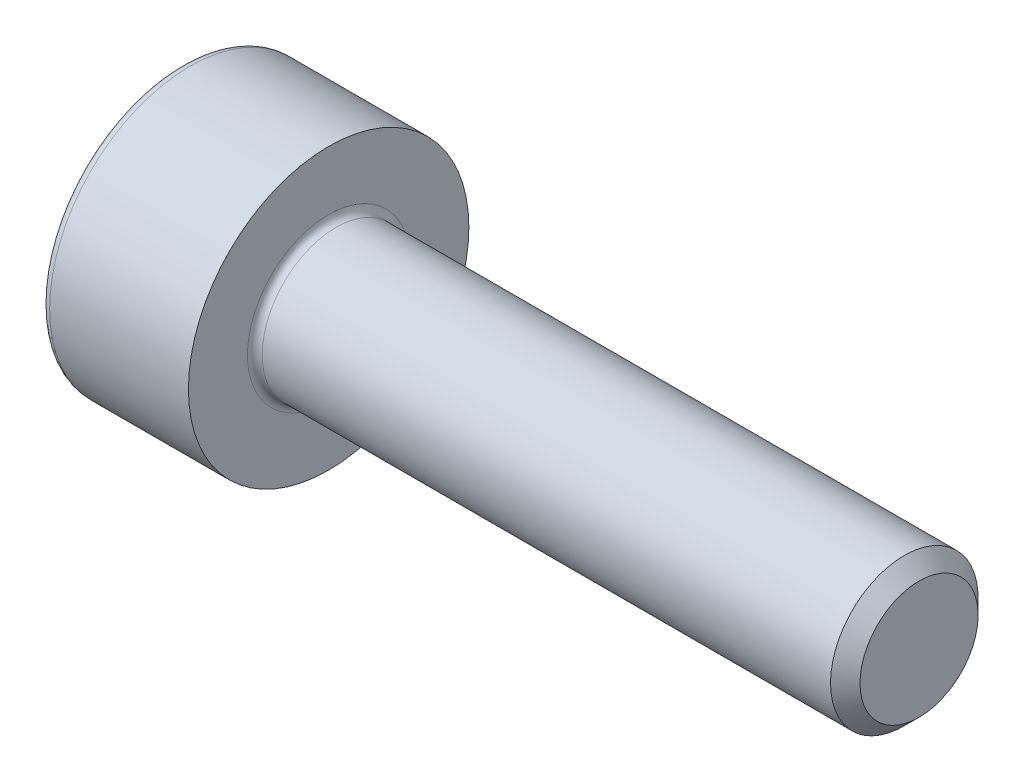
ISO-10303-21;
HEADER;
FILE_DESCRIPTION(('STEP AP214'),'2;1');
FILE_NAME('part.step','',(''),(''),'','','');
FILE_SCHEMA(('AUTOMOTIVE_DESIGN { 1 0 10303 214 1 1 1 1 }'));
ENDSEC;
DATA;
#1=APPLICATION_CONTEXT('core data for automotive mechanical design processes');
#2=APPLICATION_PROTOCOL_DEFINITION('international standard','automotive_design',2000,#1);
#3=PRODUCT_CONTEXT('',#1,'mechanical');
#4=PRODUCT('Part','Part','',(#3));
#5=PRODUCT_RELATED_PRODUCT_CATEGORY('part','',(#4));
#6=PRODUCT_DEFINITION_FORMATION('','',#4);
#7=PRODUCT_DEFINITION_CONTEXT('part definition',#1,'design');
#8=PRODUCT_DEFINITION('design','',#6,#7);
#9=PRODUCT_DEFINITION_SHAPE('','',#8);
#10=(LENGTH_UNIT() NAMED_UNIT(*) SI_UNIT(.MILLI.,.METRE.));
#11=(NAMED_UNIT(*) PLANE_ANGLE_UNIT() SI_UNIT($,.RADIAN.));
#12=(NAMED_UNIT(*) SI_UNIT($,.STERADIAN.) SOLID_ANGLE_UNIT());
#13=UNCERTAINTY_MEASURE_WITH_UNIT(LENGTH_MEASURE(1.E-05),#10,'distance_accuracy_value','');
#14=(GEOMETRIC_REPRESENTATION_CONTEXT(3) GLOBAL_UNCERTAINTY_ASSIGNED_CONTEXT((#13)) GLOBAL_UNIT_ASSIGNED_CONTEXT((#10,
#11,#12)) REPRESENTATION_CONTEXT('',''));
#15=CARTESIAN_POINT('',(0.,0.,0.));
#16=DIRECTION('',(0.,0.,1.));
#17=DIRECTION('',(1.,0.,0.));
#18=AXIS2_PLACEMENT_3D('',#15,#16,#17);
#19=CARTESIAN_POINT('',(10.0000000000048,0.,0.));
#20=DIRECTION('',(-1.,0.,0.));
#21=DIRECTION('',(0.,0.,1.));
#22=AXIS2_PLACEMENT_3D('',#19,#20,#21);
#23=PLANE('',#22);
#24=CARTESIAN_POINT('',(10.0000000000048,0.,0.));
#25=DIRECTION('',(-1.,0.,0.));
#26=DIRECTION('',(0.,0.,1.));
#27=AXIS2_PLACEMENT_3D('',#24,#25,#26);
#28=CIRCLE('',#27,0.799999999999999);
#29=CARTESIAN_POINT('',(10.0000000000048,0.,0.799999999999999));
#30=VERTEX_POINT('',#29);
#31=EDGE_CURVE('E11',#30,#30,#28,.F.);
#32=ORIENTED_EDGE('',*,*,#31,.T.);
#33=EDGE_LOOP('',(#32));
#34=FACE_BOUND('',#33,.T.);
#35=ADVANCED_FACE('F37',(#34),#23,.F.);
#36=CARTESIAN_POINT('',(0.,0.,0.));
#37=DIRECTION('',(-1.,0.,0.));
#38=DIRECTION('',(0.,0.,1.));
#39=AXIS2_PLACEMENT_3D('',#36,#37,#38);
#40=CYLINDRICAL_SURFACE('',#39,1.);
#41=CARTESIAN_POINT('',(9.80000000000477,0.,0.));
#42=DIRECTION('',(-1.,0.,0.));
#43=DIRECTION('',(0.,0.,1.));
#44=AXIS2_PLACEMENT_3D('',#41,#42,#43);
#45=CIRCLE('',#44,1.);
#46=CARTESIAN_POINT('',(9.80000000000477,0.,1.));
#47=VERTEX_POINT('',#46);
#48=EDGE_CURVE('E45',#47,#47,#45,.T.);
#49=ORIENTED_EDGE('',*,*,#48,.T.);
#50=EDGE_LOOP('',(#49));
#51=FACE_BOUND('',#50,.T.);
#52=CARTESIAN_POINT('',(2.10000000000477,0.,0.));
#53=DIRECTION('',(1.,0.,0.));
#54=DIRECTION('',(0.,0.,-1.));
#55=AXIS2_PLACEMENT_3D('',#52,#53,#54);
#56=CIRCLE('',#55,1.);
#57=CARTESIAN_POINT('',(2.10000000000477,0.,-1.));
#58=VERTEX_POINT('',#57);
#59=EDGE_CURVE('E150',#58,#58,#56,.T.);
#60=ORIENTED_EDGE('',*,*,#59,.T.);
#61=EDGE_LOOP('',(#60));
#62=FACE_BOUND('',#61,.T.);
#63=ADVANCED_FACE('F161',(#51,#62),#40,.T.);
#64=CARTESIAN_POINT('',(2.00000000000477,0.,0.));
#65=DIRECTION('',(1.,0.,0.));
#66=DIRECTION('',(0.,0.,-1.));
#67=AXIS2_PLACEMENT_3D('',#64,#65,#66);
#68=PLANE('',#67);
#69=CARTESIAN_POINT('',(2.00000000000477,0.,0.));
#70=DIRECTION('',(1.,0.,0.));
#71=DIRECTION('',(0.,0.,-1.));
#72=AXIS2_PLACEMENT_3D('',#69,#70,#71);
#73=CIRCLE('',#72,1.1);
#74=CARTESIAN_POINT('',(2.00000000000477,0.,-1.1));
#75=VERTEX_POINT('',#74);
#76=EDGE_CURVE('E147',#75,#75,#73,.F.);
#77=ORIENTED_EDGE('',*,*,#76,.T.);
#78=EDGE_LOOP('',(#77));
#79=FACE_BOUND('',#78,.T.);
#80=CARTESIAN_POINT('',(2.00000000000477,0.,0.));
#81=DIRECTION('',(-1.,0.,0.));
#82=DIRECTION('',(0.,0.,1.));
#83=AXIS2_PLACEMENT_3D('',#80,#81,#82);
#84=CIRCLE('',#83,1.9);
#85=CARTESIAN_POINT('',(2.00000000000477,0.,1.9));
#86=VERTEX_POINT('',#85);
#87=EDGE_CURVE('E139',#86,#86,#84,.T.);
#88=ORIENTED_EDGE('',*,*,#87,.F.);
#89=EDGE_LOOP('',(#88));
#90=FACE_BOUND('',#89,.T.);
#91=ADVANCED_FACE('F183',(#79,#90),#68,.T.);
#92=CARTESIAN_POINT('',(0.,0.,0.));
#93=DIRECTION('',(-1.,0.,0.));
#94=DIRECTION('',(0.,0.,1.));
#95=AXIS2_PLACEMENT_3D('',#92,#93,#94);
#96=CYLINDRICAL_SURFACE('',#95,1.9);
#97=CARTESIAN_POINT('',(0.12,0.,0.));
#98=DIRECTION('',(-1.,0.,0.));
#99=DIRECTION('',(0.,0.,1.));
#100=AXIS2_PLACEMENT_3D('',#97,#98,#99);
#101=CIRCLE('',#100,1.9);
#102=CARTESIAN_POINT('',(0.12,0.,1.9));
#103=VERTEX_POINT('',#102);
#104=EDGE_CURVE('E156',#103,#103,#101,.F.);
#105=ORIENTED_EDGE('',*,*,#104,.T.);
#106=EDGE_LOOP('',(#105));
#107=FACE_BOUND('',#106,.T.);
#108=ORIENTED_EDGE('',*,*,#87,.T.);
#109=EDGE_LOOP('',(#108));
#110=FACE_BOUND('',#109,.T.);
#111=ADVANCED_FACE('F193',(#107,#110),#96,.T.);
#112=CARTESIAN_POINT('',(0.,0.,0.));
#113=DIRECTION('',(-1.,0.,0.));
#114=DIRECTION('',(0.,0.,1.));
#115=AXIS2_PLACEMENT_3D('',#112,#113,#114);
#116=PLANE('',#115);
#117=DIRECTION('',(0.,0.5,-0.866025403784439));
#118=VECTOR('',#117,1.);
#119=CARTESIAN_POINT('',(0.,0.43301270189222,0.749999999999999));
#120=LINE('',#119,#118);
#121=CARTESIAN_POINT('',(0.,0.43301270189222,0.749999999999999));
#122=VERTEX_POINT('',#121);
#123=CARTESIAN_POINT('',(0.,0.866025403784438,0.));
#124=VERTEX_POINT('',#123);
#125=EDGE_CURVE('E52',#122,#124,#120,.T.);
#126=ORIENTED_EDGE('',*,*,#125,.F.);
#127=DIRECTION('',(0.,1.,0.));
#128=VECTOR('',#127,1.);
#129=CARTESIAN_POINT('',(0.,-0.43301270189222,0.749999999999999));
#130=LINE('',#129,#128);
#131=CARTESIAN_POINT('',(0.,-0.43301270189222,0.749999999999999));
#132=VERTEX_POINT('',#131);
#133=EDGE_CURVE('E135',#132,#122,#130,.T.);
#134=ORIENTED_EDGE('',*,*,#133,.F.);
#135=DIRECTION('',(0.,0.5,0.866025403784439));
#136=VECTOR('',#135,1.);
#137=CARTESIAN_POINT('',(0.,-0.866025403784438,0.));
#138=LINE('',#137,#136);
#139=CARTESIAN_POINT('',(0.,-0.866025403784438,0.));
#140=VERTEX_POINT('',#139);
#141=EDGE_CURVE('E133',#140,#132,#138,.T.);
#142=ORIENTED_EDGE('',*,*,#141,.F.);
#143=DIRECTION('',(0.,-0.5,0.866025403784439));
#144=VECTOR('',#143,1.);
#145=CARTESIAN_POINT('',(0.,-0.433012701892219,-0.75));
#146=LINE('',#145,#144);
#147=CARTESIAN_POINT('',(0.,-0.433012701892219,-0.75));
#148=VERTEX_POINT('',#147);
#149=EDGE_CURVE('E100',#148,#140,#146,.T.);
#150=ORIENTED_EDGE('',*,*,#149,.F.);
#151=DIRECTION('',(0.,-1.,0.));
#152=VECTOR('',#151,1.);
#153=CARTESIAN_POINT('',(0.,0.433012701892219,-0.75));
#154=LINE('',#153,#152);
#155=CARTESIAN_POINT('',(0.,0.433012701892219,-0.75));
#156=VERTEX_POINT('',#155);
#157=EDGE_CURVE('E129',#156,#148,#154,.T.);
#158=ORIENTED_EDGE('',*,*,#157,.F.);
#159=DIRECTION('',(0.,-0.5,-0.866025403784439));
#160=VECTOR('',#159,1.);
#161=CARTESIAN_POINT('',(0.,0.866025403784438,0.));
#162=LINE('',#161,#160);
#163=EDGE_CURVE('E126',#124,#156,#162,.T.);
#164=ORIENTED_EDGE('',*,*,#163,.F.);
#165=EDGE_LOOP('',(#126,#134,#142,#150,#158,#164));
#166=FACE_BOUND('',#165,.T.);
#167=CARTESIAN_POINT('',(0.,0.,0.));
#168=DIRECTION('',(-1.,0.,0.));
#169=DIRECTION('',(0.,0.,1.));
#170=AXIS2_PLACEMENT_3D('',#167,#168,#169);
#171=CIRCLE('',#170,1.78);
#172=CARTESIAN_POINT('',(0.,0.,1.78));
#173=VERTEX_POINT('',#172);
#174=EDGE_CURVE('E153',#173,#173,#171,.T.);
#175=ORIENTED_EDGE('',*,*,#174,.T.);
#176=EDGE_LOOP('',(#175));
#177=FACE_BOUND('',#176,.T.);
#178=ADVANCED_FACE('F188',(#166,#177),#116,.T.);
#179=CARTESIAN_POINT('',(2.10000000000477,0.,0.));
#180=DIRECTION('',(1.,0.,0.));
#181=DIRECTION('',(0.,0.,-1.));
#182=AXIS2_PLACEMENT_3D('',#179,#180,#181);
#183=TOROIDAL_SURFACE('',#182,1.1,0.1);
#184=ORIENTED_EDGE('',*,*,#59,.F.);
#185=EDGE_LOOP('',(#184));
#186=FACE_BOUND('',#185,.T.);
#187=ORIENTED_EDGE('',*,*,#76,.F.);
#188=EDGE_LOOP('',(#187));
#189=FACE_BOUND('',#188,.T.);
#190=ADVANCED_FACE('F174',(#186,#189),#183,.F.);
#191=CARTESIAN_POINT('',(0.12,0.,0.));
#192=DIRECTION('',(-1.,0.,0.));
#193=DIRECTION('',(0.,0.,1.));
#194=AXIS2_PLACEMENT_3D('',#191,#192,#193);
#195=TOROIDAL_SURFACE('',#194,1.78,0.12);
#196=ORIENTED_EDGE('',*,*,#104,.F.);
#197=EDGE_LOOP('',(#196));
#198=FACE_BOUND('',#197,.T.);
#199=ORIENTED_EDGE('',*,*,#174,.F.);
#200=EDGE_LOOP('',(#199));
#201=FACE_BOUND('',#200,.T.);
#202=ADVANCED_FACE('F166',(#198,#201),#195,.T.);
#203=CARTESIAN_POINT('',(9.80000000000477,0.,0.));
#204=DIRECTION('',(-1.,0.,0.));
#205=DIRECTION('',(0.,0.,1.));
#206=AXIS2_PLACEMENT_3D('',#203,#204,#205);
#207=CONICAL_SURFACE('',#206,1.,0.785398163397448);
#208=ORIENTED_EDGE('',*,*,#31,.F.);
#209=EDGE_LOOP('',(#208));
#210=FACE_BOUND('',#209,.T.);
#211=ORIENTED_EDGE('',*,*,#48,.F.);
#212=EDGE_LOOP('',(#211));
#213=FACE_BOUND('',#212,.T.);
#214=ADVANCED_FACE('F39',(#210,#213),#207,.T.);
#215=CARTESIAN_POINT('',(1.,0.43301270189222,0.749999999999999));
#216=DIRECTION('',(0.,0.866025403784439,0.5));
#217=DIRECTION('',(0.,-0.5,0.866025403784439));
#218=AXIS2_PLACEMENT_3D('',#215,#216,#217);
#219=PLANE('',#218);
#220=ORIENTED_EDGE('',*,*,#125,.T.);
#221=DIRECTION('',(-1.,0.,0.));
#222=VECTOR('',#221,1.);
#223=CARTESIAN_POINT('',(1.,0.866025403784438,0.));
#224=LINE('',#223,#222);
#225=CARTESIAN_POINT('',(1.,0.866025403784438,0.));
#226=VERTEX_POINT('',#225);
#227=EDGE_CURVE('E82',#226,#124,#224,.T.);
#228=ORIENTED_EDGE('',*,*,#227,.F.);
#229=DIRECTION('',(0.,0.5,-0.866025403784439));
#230=VECTOR('',#229,1.);
#231=CARTESIAN_POINT('',(1.,0.43301270189222,0.749999999999999));
#232=LINE('',#231,#230);
#233=CARTESIAN_POINT('',(1.,0.43301270189222,0.749999999999999));
#234=VERTEX_POINT('',#233);
#235=EDGE_CURVE('E137',#234,#226,#232,.T.);
#236=ORIENTED_EDGE('',*,*,#235,.F.);
#237=DIRECTION('',(-1.,0.,0.));
#238=VECTOR('',#237,1.);
#239=CARTESIAN_POINT('',(1.,0.43301270189222,0.749999999999999));
#240=LINE('',#239,#238);
#241=EDGE_CURVE('E60',#234,#122,#240,.T.);
#242=ORIENTED_EDGE('',*,*,#241,.T.);
#243=EDGE_LOOP('',(#220,#228,#236,#242));
#244=FACE_BOUND('',#243,.T.);
#245=ADVANCED_FACE('F165',(#244),#219,.F.);
#246=CARTESIAN_POINT('',(1.,-0.43301270189222,0.749999999999999));
#247=DIRECTION('',(0.,0.,1.));
#248=DIRECTION('',(0.,-1.,0.));
#249=AXIS2_PLACEMENT_3D('',#246,#247,#248);
#250=PLANE('',#249);
#251=ORIENTED_EDGE('',*,*,#133,.T.);
#252=ORIENTED_EDGE('',*,*,#241,.F.);
#253=DIRECTION('',(0.,1.,0.));
#254=VECTOR('',#253,1.);
#255=CARTESIAN_POINT('',(1.,-0.43301270189222,0.749999999999999));
#256=LINE('',#255,#254);
#257=CARTESIAN_POINT('',(1.,-0.43301270189222,0.749999999999999));
#258=VERTEX_POINT('',#257);
#259=EDGE_CURVE('E112',#258,#234,#256,.T.);
#260=ORIENTED_EDGE('',*,*,#259,.F.);
#261=DIRECTION('',(-1.,0.,0.));
#262=VECTOR('',#261,1.);
#263=CARTESIAN_POINT('',(1.,-0.43301270189222,0.749999999999999));
#264=LINE('',#263,#262);
#265=EDGE_CURVE('E104',#258,#132,#264,.T.);
#266=ORIENTED_EDGE('',*,*,#265,.T.);
#267=EDGE_LOOP('',(#251,#252,#260,#266));
#268=FACE_BOUND('',#267,.T.);
#269=ADVANCED_FACE('F172',(#268),#250,.F.);
#270=CARTESIAN_POINT('',(1.,-0.866025403784438,0.));
#271=DIRECTION('',(0.,-0.866025403784439,0.5));
#272=DIRECTION('',(0.,-0.5,-0.866025403784439));
#273=AXIS2_PLACEMENT_3D('',#270,#271,#272);
#274=PLANE('',#273);
#275=ORIENTED_EDGE('',*,*,#141,.T.);
#276=ORIENTED_EDGE('',*,*,#265,.F.);
#277=DIRECTION('',(0.,0.5,0.866025403784439));
#278=VECTOR('',#277,1.);
#279=CARTESIAN_POINT('',(1.,-0.866025403784438,0.));
#280=LINE('',#279,#278);
#281=CARTESIAN_POINT('',(1.,-0.866025403784438,0.));
#282=VERTEX_POINT('',#281);
#283=EDGE_CURVE('E108',#282,#258,#280,.T.);
#284=ORIENTED_EDGE('',*,*,#283,.F.);
#285=DIRECTION('',(-1.,0.,0.));
#286=VECTOR('',#285,1.);
#287=CARTESIAN_POINT('',(1.,-0.866025403784438,0.));
#288=LINE('',#287,#286);
#289=EDGE_CURVE('E93',#282,#140,#288,.T.);
#290=ORIENTED_EDGE('',*,*,#289,.T.);
#291=EDGE_LOOP('',(#275,#276,#284,#290));
#292=FACE_BOUND('',#291,.T.);
#293=ADVANCED_FACE('F109',(#292),#274,.F.);
#294=CARTESIAN_POINT('',(1.,-0.433012701892219,-0.75));
#295=DIRECTION('',(0.,-0.866025403784439,-0.5));
#296=DIRECTION('',(0.,0.5,-0.866025403784439));
#297=AXIS2_PLACEMENT_3D('',#294,#295,#296);
#298=PLANE('',#297);
#299=ORIENTED_EDGE('',*,*,#149,.T.);
#300=ORIENTED_EDGE('',*,*,#289,.F.);
#301=DIRECTION('',(0.,-0.5,0.866025403784439));
#302=VECTOR('',#301,1.);
#303=CARTESIAN_POINT('',(1.,-0.433012701892219,-0.75));
#304=LINE('',#303,#302);
#305=CARTESIAN_POINT('',(1.,-0.433012701892219,-0.75));
#306=VERTEX_POINT('',#305);
#307=EDGE_CURVE('E97',#306,#282,#304,.T.);
#308=ORIENTED_EDGE('',*,*,#307,.F.);
#309=DIRECTION('',(-1.,0.,0.));
#310=VECTOR('',#309,1.);
#311=CARTESIAN_POINT('',(1.,-0.433012701892219,-0.75));
#312=LINE('',#311,#310);
#313=EDGE_CURVE('E105',#306,#148,#312,.T.);
#314=ORIENTED_EDGE('',*,*,#313,.T.);
#315=EDGE_LOOP('',(#299,#300,#308,#314));
#316=FACE_BOUND('',#315,.T.);
#317=ADVANCED_FACE('F95',(#316),#298,.F.);
#318=CARTESIAN_POINT('',(1.,0.433012701892219,-0.75));
#319=DIRECTION('',(0.,0.,-1.));
#320=DIRECTION('',(0.,1.,0.));
#321=AXIS2_PLACEMENT_3D('',#318,#319,#320);
#322=PLANE('',#321);
#323=ORIENTED_EDGE('',*,*,#157,.T.);
#324=ORIENTED_EDGE('',*,*,#313,.F.);
#325=DIRECTION('',(0.,-1.,0.));
#326=VECTOR('',#325,1.);
#327=CARTESIAN_POINT('',(1.,0.433012701892219,-0.75));
#328=LINE('',#327,#326);
#329=CARTESIAN_POINT('',(1.,0.433012701892219,-0.75));
#330=VERTEX_POINT('',#329);
#331=EDGE_CURVE('E118',#330,#306,#328,.T.);
#332=ORIENTED_EDGE('',*,*,#331,.F.);
#333=DIRECTION('',(-1.,0.,0.));
#334=VECTOR('',#333,1.);
#335=CARTESIAN_POINT('',(1.,0.433012701892219,-0.75));
#336=LINE('',#335,#334);
#337=EDGE_CURVE('E142',#330,#156,#336,.T.);
#338=ORIENTED_EDGE('',*,*,#337,.T.);
#339=EDGE_LOOP('',(#323,#324,#332,#338));
#340=FACE_BOUND('',#339,.T.);
#341=ADVANCED_FACE('F213',(#340),#322,.F.);
#342=CARTESIAN_POINT('',(1.,0.866025403784438,0.));
#343=DIRECTION('',(0.,0.866025403784439,-0.5));
#344=DIRECTION('',(0.,0.5,0.866025403784439));
#345=AXIS2_PLACEMENT_3D('',#342,#343,#344);
#346=PLANE('',#345);
#347=ORIENTED_EDGE('',*,*,#163,.T.);
#348=ORIENTED_EDGE('',*,*,#337,.F.);
#349=DIRECTION('',(0.,-0.5,-0.866025403784439));
#350=VECTOR('',#349,1.);
#351=CARTESIAN_POINT('',(1.,0.866025403784438,0.));
#352=LINE('',#351,#350);
#353=EDGE_CURVE('E120',#226,#330,#352,.T.);
#354=ORIENTED_EDGE('',*,*,#353,.F.);
#355=ORIENTED_EDGE('',*,*,#227,.T.);
#356=EDGE_LOOP('',(#347,#348,#354,#355));
#357=FACE_BOUND('',#356,.T.);
#358=ADVANCED_FACE('F210',(#357),#346,.F.);
#359=CARTESIAN_POINT('',(1.,0.,0.));
#360=DIRECTION('',(-1.,0.,0.));
#361=DIRECTION('',(0.,0.,1.));
#362=AXIS2_PLACEMENT_3D('',#359,#360,#361);
#363=PLANE('',#362);
#364=ORIENTED_EDGE('',*,*,#235,.T.);
#365=ORIENTED_EDGE('',*,*,#353,.T.);
#366=ORIENTED_EDGE('',*,*,#331,.T.);
#367=ORIENTED_EDGE('',*,*,#307,.T.);
#368=ORIENTED_EDGE('',*,*,#283,.T.);
#369=ORIENTED_EDGE('',*,*,#259,.T.);
#370=EDGE_LOOP('',(#364,#365,#366,#367,#368,#369));
#371=FACE_BOUND('',#370,.T.);
#372=ADVANCED_FACE('F115',(#371),#363,.T.);
#373=CLOSED_SHELL('',(#35,#63,#91,#111,#178,#190,#202,#214,#245,#269,#293,#317,#341,#358,#372));
#374=MANIFOLD_SOLID_BREP('B2',#373);
#375=ADVANCED_BREP_SHAPE_REPRESENTATION('',(#18,#374),#14);
#376=SHAPE_DEFINITION_REPRESENTATION(#9,#375);
ENDSEC;
END-ISO-10303-21;
